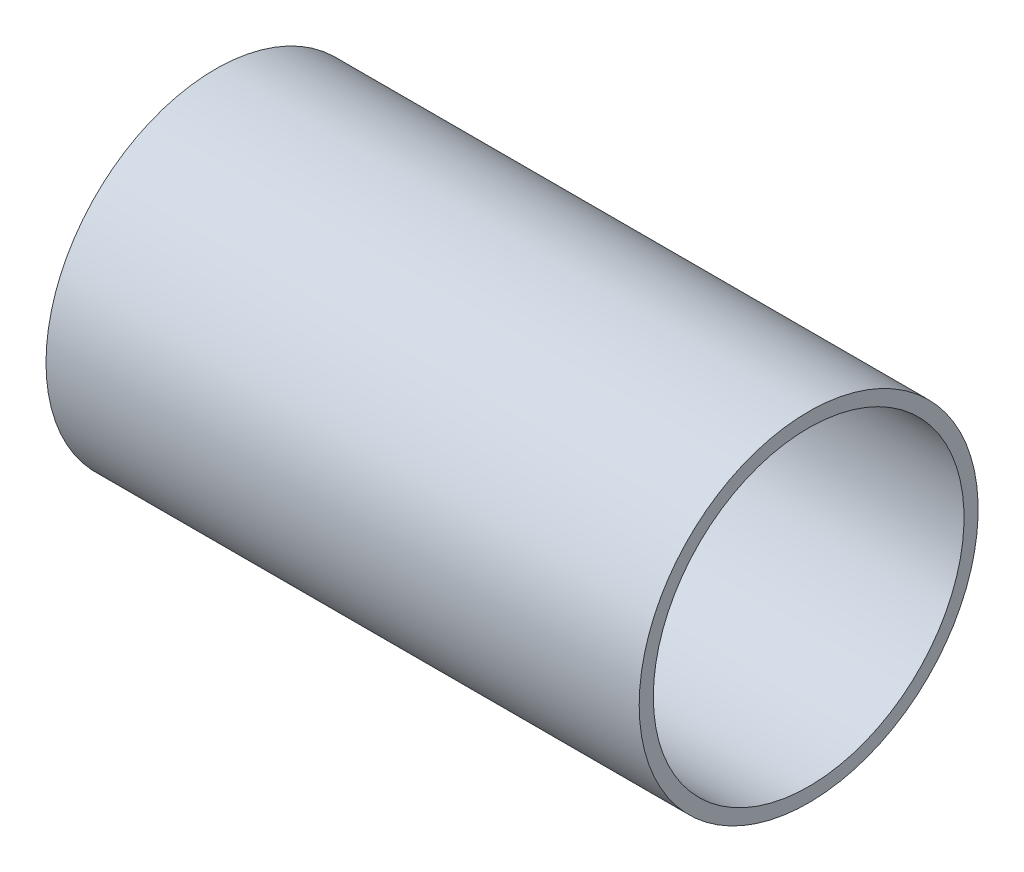
ISO-10303-21;
HEADER;
FILE_DESCRIPTION(('STEP AP214'),'2;1');
FILE_NAME('part.step','',(''),(''),'','','');
FILE_SCHEMA(('AUTOMOTIVE_DESIGN { 1 0 10303 214 1 1 1 1 }'));
ENDSEC;
DATA;
#1=APPLICATION_CONTEXT('core data for automotive mechanical design processes');
#2=APPLICATION_PROTOCOL_DEFINITION('international standard','automotive_design',2000,#1);
#3=PRODUCT_CONTEXT('',#1,'mechanical');
#4=PRODUCT('Part','Part','',(#3));
#5=PRODUCT_RELATED_PRODUCT_CATEGORY('part','',(#4));
#6=PRODUCT_DEFINITION_FORMATION('','',#4);
#7=PRODUCT_DEFINITION_CONTEXT('part definition',#1,'design');
#8=PRODUCT_DEFINITION('design','',#6,#7);
#9=PRODUCT_DEFINITION_SHAPE('','',#8);
#10=(LENGTH_UNIT() NAMED_UNIT(*) SI_UNIT(.MILLI.,.METRE.));
#11=(NAMED_UNIT(*) PLANE_ANGLE_UNIT() SI_UNIT($,.RADIAN.));
#12=(NAMED_UNIT(*) SI_UNIT($,.STERADIAN.) SOLID_ANGLE_UNIT());
#13=UNCERTAINTY_MEASURE_WITH_UNIT(LENGTH_MEASURE(1.E-05),#10,'distance_accuracy_value','');
#14=(GEOMETRIC_REPRESENTATION_CONTEXT(3) GLOBAL_UNCERTAINTY_ASSIGNED_CONTEXT((#13)) GLOBAL_UNIT_ASSIGNED_CONTEXT((#10,
#11,#12)) REPRESENTATION_CONTEXT('',''));
#15=CARTESIAN_POINT('',(0.,0.,0.));
#16=DIRECTION('',(0.,0.,1.));
#17=DIRECTION('',(1.,0.,0.));
#18=AXIS2_PLACEMENT_3D('',#15,#16,#17);
#19=CARTESIAN_POINT('',(0.,11.,0.));
#20=DIRECTION('',(1.,0.,0.));
#21=DIRECTION('',(0.,0.,-1.));
#22=AXIS2_PLACEMENT_3D('',#19,#20,#21);
#23=PLANE('',#22);
#24=CARTESIAN_POINT('',(0.,0.,0.));
#25=DIRECTION('',(-1.,0.,0.));
#26=DIRECTION('',(0.,0.,1.));
#27=AXIS2_PLACEMENT_3D('',#24,#25,#26);
#28=CIRCLE('',#27,11.);
#29=CARTESIAN_POINT('',(0.,0.,11.));
#30=VERTEX_POINT('',#29);
#31=EDGE_CURVE('E62',#30,#30,#28,.T.);
#32=ORIENTED_EDGE('',*,*,#31,.F.);
#33=EDGE_LOOP('',(#32));
#34=FACE_BOUND('',#33,.T.);
#35=CARTESIAN_POINT('',(0.,0.,0.));
#36=DIRECTION('',(-1.,0.,0.));
#37=DIRECTION('',(0.,0.,1.));
#38=AXIS2_PLACEMENT_3D('',#35,#36,#37);
#39=CIRCLE('',#38,12.);
#40=CARTESIAN_POINT('',(0.,0.,12.));
#41=VERTEX_POINT('',#40);
#42=EDGE_CURVE('E10',#41,#41,#39,.T.);
#43=ORIENTED_EDGE('',*,*,#42,.T.);
#44=EDGE_LOOP('',(#43));
#45=FACE_BOUND('',#44,.T.);
#46=ADVANCED_FACE('F45',(#34,#45),#23,.F.);
#47=CARTESIAN_POINT('',(0.,0.,0.));
#48=DIRECTION('',(-1.,0.,0.));
#49=DIRECTION('',(0.,0.,1.));
#50=AXIS2_PLACEMENT_3D('',#47,#48,#49);
#51=CYLINDRICAL_SURFACE('',#50,12.);
#52=ORIENTED_EDGE('',*,*,#42,.F.);
#53=EDGE_LOOP('',(#52));
#54=FACE_BOUND('',#53,.T.);
#55=CARTESIAN_POINT('',(42.,0.,0.));
#56=DIRECTION('',(-1.,0.,0.));
#57=DIRECTION('',(0.,0.,1.));
#58=AXIS2_PLACEMENT_3D('',#55,#56,#57);
#59=CIRCLE('',#58,12.);
#60=CARTESIAN_POINT('',(42.,0.,12.));
#61=VERTEX_POINT('',#60);
#62=EDGE_CURVE('E52',#61,#61,#59,.T.);
#63=ORIENTED_EDGE('',*,*,#62,.T.);
#64=EDGE_LOOP('',(#63));
#65=FACE_BOUND('',#64,.T.);
#66=ADVANCED_FACE('F72',(#54,#65),#51,.T.);
#67=CARTESIAN_POINT('',(42.,12.,0.));
#68=DIRECTION('',(-1.,0.,0.));
#69=DIRECTION('',(0.,0.,1.));
#70=AXIS2_PLACEMENT_3D('',#67,#68,#69);
#71=PLANE('',#70);
#72=ORIENTED_EDGE('',*,*,#62,.F.);
#73=EDGE_LOOP('',(#72));
#74=FACE_BOUND('',#73,.T.);
#75=CARTESIAN_POINT('',(42.,0.,0.));
#76=DIRECTION('',(-1.,0.,0.));
#77=DIRECTION('',(0.,0.,1.));
#78=AXIS2_PLACEMENT_3D('',#75,#76,#77);
#79=CIRCLE('',#78,11.);
#80=CARTESIAN_POINT('',(42.,0.,11.));
#81=VERTEX_POINT('',#80);
#82=EDGE_CURVE('E57',#81,#81,#79,.T.);
#83=ORIENTED_EDGE('',*,*,#82,.T.);
#84=EDGE_LOOP('',(#83));
#85=FACE_BOUND('',#84,.T.);
#86=ADVANCED_FACE('F76',(#74,#85),#71,.F.);
#87=CARTESIAN_POINT('',(0.,0.,0.));
#88=DIRECTION('',(-1.,0.,0.));
#89=DIRECTION('',(0.,0.,1.));
#90=AXIS2_PLACEMENT_3D('',#87,#88,#89);
#91=CYLINDRICAL_SURFACE('',#90,11.);
#92=ORIENTED_EDGE('',*,*,#82,.F.);
#93=EDGE_LOOP('',(#92));
#94=FACE_BOUND('',#93,.T.);
#95=ORIENTED_EDGE('',*,*,#31,.T.);
#96=EDGE_LOOP('',(#95));
#97=FACE_BOUND('',#96,.T.);
#98=ADVANCED_FACE('F69',(#94,#97),#91,.F.);
#99=CLOSED_SHELL('',(#46,#66,#86,#98));
#100=MANIFOLD_SOLID_BREP('B2',#99);
#101=ADVANCED_BREP_SHAPE_REPRESENTATION('',(#18,#100),#14);
#102=SHAPE_DEFINITION_REPRESENTATION(#9,#101);
ENDSEC;
END-ISO-10303-21;
